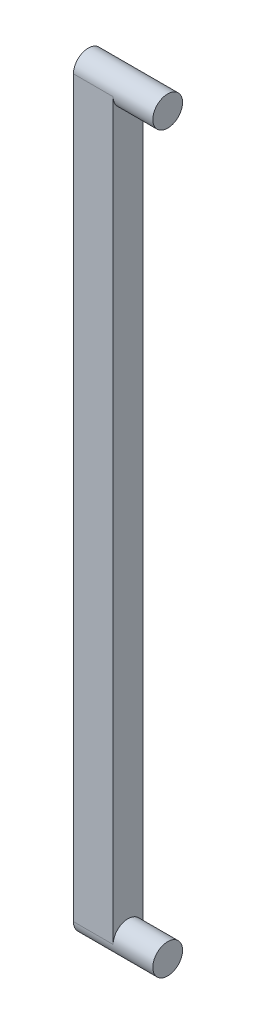
ISO-10303-21;
HEADER;
FILE_DESCRIPTION(('STEP AP214'),'2;1');
FILE_NAME('part.step','',(''),(''),'','','');
FILE_SCHEMA(('AUTOMOTIVE_DESIGN { 1 0 10303 214 1 1 1 1 }'));
ENDSEC;
DATA;
#1=APPLICATION_CONTEXT('core data for automotive mechanical design processes');
#2=APPLICATION_PROTOCOL_DEFINITION('international standard','automotive_design',2000,#1);
#3=PRODUCT_CONTEXT('',#1,'mechanical');
#4=PRODUCT('Part','Part','',(#3));
#5=PRODUCT_RELATED_PRODUCT_CATEGORY('part','',(#4));
#6=PRODUCT_DEFINITION_FORMATION('','',#4);
#7=PRODUCT_DEFINITION_CONTEXT('part definition',#1,'design');
#8=PRODUCT_DEFINITION('design','',#6,#7);
#9=PRODUCT_DEFINITION_SHAPE('','',#8);
#10=(LENGTH_UNIT() NAMED_UNIT(*) SI_UNIT(.MILLI.,.METRE.));
#11=(NAMED_UNIT(*) PLANE_ANGLE_UNIT() SI_UNIT($,.RADIAN.));
#12=(NAMED_UNIT(*) SI_UNIT($,.STERADIAN.) SOLID_ANGLE_UNIT());
#13=UNCERTAINTY_MEASURE_WITH_UNIT(LENGTH_MEASURE(1.E-05),#10,'distance_accuracy_value','');
#14=(GEOMETRIC_REPRESENTATION_CONTEXT(3) GLOBAL_UNCERTAINTY_ASSIGNED_CONTEXT((#13)) GLOBAL_UNIT_ASSIGNED_CONTEXT((#10,
#11,#12)) REPRESENTATION_CONTEXT('',''));
#15=CARTESIAN_POINT('',(0.,0.,0.));
#16=DIRECTION('',(0.,0.,1.));
#17=DIRECTION('',(1.,0.,0.));
#18=AXIS2_PLACEMENT_3D('',#15,#16,#17);
#19=CARTESIAN_POINT('',(2.,0.,0.75));
#20=DIRECTION('',(-1.,0.,0.));
#21=DIRECTION('',(0.,0.,1.));
#22=AXIS2_PLACEMENT_3D('',#19,#20,#21);
#23=CYLINDRICAL_SURFACE('',#22,0.75);
#24=CARTESIAN_POINT('',(0.,0.,0.75));
#25=DIRECTION('',(1.,0.,0.));
#26=DIRECTION('',(0.,0.,-1.));
#27=AXIS2_PLACEMENT_3D('',#24,#25,#26);
#28=CIRCLE('',#27,0.75);
#29=CARTESIAN_POINT('',(0.,0.,1.5));
#30=VERTEX_POINT('',#29);
#31=CARTESIAN_POINT('',(0.,0.,0.));
#32=VERTEX_POINT('',#31);
#33=EDGE_CURVE('E83',#30,#32,#28,.T.);
#34=ORIENTED_EDGE('',*,*,#33,.T.);
#35=DIRECTION('',(-1.,0.,0.));
#36=VECTOR('',#35,1.);
#37=CARTESIAN_POINT('',(2.,0.,0.));
#38=LINE('',#37,#36);
#39=CARTESIAN_POINT('',(2.,0.,0.));
#40=VERTEX_POINT('',#39);
#41=EDGE_CURVE('E11',#40,#32,#38,.T.);
#42=ORIENTED_EDGE('',*,*,#41,.F.);
#43=CARTESIAN_POINT('',(2.,0.,0.75));
#44=DIRECTION('',(1.,0.,0.));
#45=DIRECTION('',(0.,0.,-1.));
#46=AXIS2_PLACEMENT_3D('',#43,#44,#45);
#47=CIRCLE('',#46,0.75);
#48=CARTESIAN_POINT('',(2.,0.,1.5));
#49=VERTEX_POINT('',#48);
#50=EDGE_CURVE('E85',#49,#40,#47,.F.);
#51=ORIENTED_EDGE('',*,*,#50,.F.);
#52=DIRECTION('',(-1.,0.,0.));
#53=VECTOR('',#52,1.);
#54=CARTESIAN_POINT('',(2.,0.,1.5));
#55=LINE('',#54,#53);
#56=EDGE_CURVE('E79',#49,#30,#55,.T.);
#57=ORIENTED_EDGE('',*,*,#56,.T.);
#58=EDGE_LOOP('',(#34,#42,#51,#57));
#59=FACE_BOUND('',#58,.T.);
#60=CARTESIAN_POINT('',(4.,0.,0.75));
#61=DIRECTION('',(1.,0.,0.));
#62=DIRECTION('',(0.,0.,-1.));
#63=AXIS2_PLACEMENT_3D('',#60,#61,#62);
#64=CIRCLE('',#63,0.75);
#65=CARTESIAN_POINT('',(4.,0.,0.));
#66=VERTEX_POINT('',#65);
#67=EDGE_CURVE('E116',#66,#66,#64,.T.);
#68=ORIENTED_EDGE('',*,*,#67,.F.);
#69=EDGE_LOOP('',(#68));
#70=FACE_BOUND('',#69,.T.);
#71=ADVANCED_FACE('F39',(#59,#70),#23,.T.);
#72=CARTESIAN_POINT('',(2.,0.,0.));
#73=DIRECTION('',(0.,0.,1.));
#74=DIRECTION('',(1.,0.,0.));
#75=AXIS2_PLACEMENT_3D('',#72,#73,#74);
#76=PLANE('',#75);
#77=DIRECTION('',(0.,1.,0.));
#78=VECTOR('',#77,1.);
#79=CARTESIAN_POINT('',(0.,0.,0.));
#80=LINE('',#79,#78);
#81=CARTESIAN_POINT('',(0.,37.,0.));
#82=VERTEX_POINT('',#81);
#83=EDGE_CURVE('E94',#32,#82,#80,.T.);
#84=ORIENTED_EDGE('',*,*,#83,.T.);
#85=DIRECTION('',(-1.,0.,0.));
#86=VECTOR('',#85,1.);
#87=CARTESIAN_POINT('',(2.,37.,0.));
#88=LINE('',#87,#86);
#89=CARTESIAN_POINT('',(2.,37.,0.));
#90=VERTEX_POINT('',#89);
#91=EDGE_CURVE('E47',#90,#82,#88,.T.);
#92=ORIENTED_EDGE('',*,*,#91,.F.);
#93=DIRECTION('',(0.,1.,0.));
#94=VECTOR('',#93,1.);
#95=CARTESIAN_POINT('',(2.,0.,0.));
#96=LINE('',#95,#94);
#97=EDGE_CURVE('E55',#40,#90,#96,.T.);
#98=ORIENTED_EDGE('',*,*,#97,.F.);
#99=ORIENTED_EDGE('',*,*,#41,.T.);
#100=EDGE_LOOP('',(#84,#92,#98,#99));
#101=FACE_BOUND('',#100,.T.);
#102=ADVANCED_FACE('F110',(#101),#76,.F.);
#103=CARTESIAN_POINT('',(2.,37.,0.75));
#104=DIRECTION('',(-1.,0.,0.));
#105=DIRECTION('',(0.,0.,1.));
#106=AXIS2_PLACEMENT_3D('',#103,#104,#105);
#107=CYLINDRICAL_SURFACE('',#106,0.749999999999999);
#108=CARTESIAN_POINT('',(0.,37.,0.75));
#109=DIRECTION('',(1.,0.,0.));
#110=DIRECTION('',(0.,0.,-1.));
#111=AXIS2_PLACEMENT_3D('',#108,#109,#110);
#112=CIRCLE('',#111,0.749999999999999);
#113=CARTESIAN_POINT('',(0.,37.,1.5));
#114=VERTEX_POINT('',#113);
#115=EDGE_CURVE('E98',#82,#114,#112,.T.);
#116=ORIENTED_EDGE('',*,*,#115,.T.);
#117=DIRECTION('',(-1.,0.,0.));
#118=VECTOR('',#117,1.);
#119=CARTESIAN_POINT('',(2.,37.,1.5));
#120=LINE('',#119,#118);
#121=CARTESIAN_POINT('',(2.,37.,1.5));
#122=VERTEX_POINT('',#121);
#123=EDGE_CURVE('E72',#122,#114,#120,.T.);
#124=ORIENTED_EDGE('',*,*,#123,.F.);
#125=CARTESIAN_POINT('',(2.,37.,0.75));
#126=DIRECTION('',(1.,0.,0.));
#127=DIRECTION('',(0.,0.,-1.));
#128=AXIS2_PLACEMENT_3D('',#125,#126,#127);
#129=CIRCLE('',#128,0.749999999999999);
#130=EDGE_CURVE('E95',#90,#122,#129,.F.);
#131=ORIENTED_EDGE('',*,*,#130,.F.);
#132=ORIENTED_EDGE('',*,*,#91,.T.);
#133=EDGE_LOOP('',(#116,#124,#131,#132));
#134=FACE_BOUND('',#133,.T.);
#135=CARTESIAN_POINT('',(4.,37.,0.75));
#136=DIRECTION('',(1.,0.,0.));
#137=DIRECTION('',(0.,0.,-1.));
#138=AXIS2_PLACEMENT_3D('',#135,#136,#137);
#139=CIRCLE('',#138,0.749999999999999);
#140=CARTESIAN_POINT('',(4.,37.,0.));
#141=VERTEX_POINT('',#140);
#142=EDGE_CURVE('E115',#141,#141,#139,.T.);
#143=ORIENTED_EDGE('',*,*,#142,.F.);
#144=EDGE_LOOP('',(#143));
#145=FACE_BOUND('',#144,.T.);
#146=ADVANCED_FACE('F107',(#134,#145),#107,.T.);
#147=CARTESIAN_POINT('',(2.,0.,1.5));
#148=DIRECTION('',(0.,0.,1.));
#149=DIRECTION('',(1.,0.,0.));
#150=AXIS2_PLACEMENT_3D('',#147,#148,#149);
#151=PLANE('',#150);
#152=DIRECTION('',(0.,1.,0.));
#153=VECTOR('',#152,1.);
#154=CARTESIAN_POINT('',(0.,0.,1.5));
#155=LINE('',#154,#153);
#156=EDGE_CURVE('E93',#30,#114,#155,.T.);
#157=ORIENTED_EDGE('',*,*,#156,.F.);
#158=ORIENTED_EDGE('',*,*,#56,.F.);
#159=DIRECTION('',(0.,1.,0.));
#160=VECTOR('',#159,1.);
#161=CARTESIAN_POINT('',(2.,0.,1.5));
#162=LINE('',#161,#160);
#163=EDGE_CURVE('E87',#49,#122,#162,.T.);
#164=ORIENTED_EDGE('',*,*,#163,.T.);
#165=ORIENTED_EDGE('',*,*,#123,.T.);
#166=EDGE_LOOP('',(#157,#158,#164,#165));
#167=FACE_BOUND('',#166,.T.);
#168=ADVANCED_FACE('F97',(#167),#151,.T.);
#169=CARTESIAN_POINT('',(2.,0.,0.));
#170=DIRECTION('',(1.,0.,0.));
#171=DIRECTION('',(0.,0.,-1.));
#172=AXIS2_PLACEMENT_3D('',#169,#170,#171);
#173=PLANE('',#172);
#174=ORIENTED_EDGE('',*,*,#97,.T.);
#175=ORIENTED_EDGE('',*,*,#130,.T.);
#176=ORIENTED_EDGE('',*,*,#163,.F.);
#177=ORIENTED_EDGE('',*,*,#50,.T.);
#178=EDGE_LOOP('',(#174,#175,#176,#177));
#179=FACE_BOUND('',#178,.T.);
#180=ADVANCED_FACE('F129',(#179),#173,.T.);
#181=CARTESIAN_POINT('',(0.,0.,0.));
#182=DIRECTION('',(1.,0.,0.));
#183=DIRECTION('',(0.,0.,-1.));
#184=AXIS2_PLACEMENT_3D('',#181,#182,#183);
#185=PLANE('',#184);
#186=ORIENTED_EDGE('',*,*,#156,.T.);
#187=ORIENTED_EDGE('',*,*,#115,.F.);
#188=ORIENTED_EDGE('',*,*,#83,.F.);
#189=ORIENTED_EDGE('',*,*,#33,.F.);
#190=EDGE_LOOP('',(#186,#187,#188,#189));
#191=FACE_BOUND('',#190,.T.);
#192=ADVANCED_FACE('F91',(#191),#185,.F.);
#193=CARTESIAN_POINT('',(4.,0.,0.));
#194=DIRECTION('',(1.,0.,0.));
#195=DIRECTION('',(0.,0.,-1.));
#196=AXIS2_PLACEMENT_3D('',#193,#194,#195);
#197=PLANE('',#196);
#198=ORIENTED_EDGE('',*,*,#67,.T.);
#199=EDGE_LOOP('',(#198));
#200=FACE_BOUND('',#199,.T.);
#201=ADVANCED_FACE('F181',(#200),#197,.T.);
#202=CARTESIAN_POINT('',(4.,0.,0.));
#203=DIRECTION('',(1.,0.,0.));
#204=DIRECTION('',(0.,0.,-1.));
#205=AXIS2_PLACEMENT_3D('',#202,#203,#204);
#206=PLANE('',#205);
#207=ORIENTED_EDGE('',*,*,#142,.T.);
#208=EDGE_LOOP('',(#207));
#209=FACE_BOUND('',#208,.T.);
#210=ADVANCED_FACE('F122',(#209),#206,.T.);
#211=CLOSED_SHELL('',(#71,#102,#146,#168,#180,#192,#201,#210));
#212=MANIFOLD_SOLID_BREP('B2',#211);
#213=ADVANCED_BREP_SHAPE_REPRESENTATION('',(#18,#212),#14);
#214=SHAPE_DEFINITION_REPRESENTATION(#9,#213);
ENDSEC;
END-ISO-10303-21;
